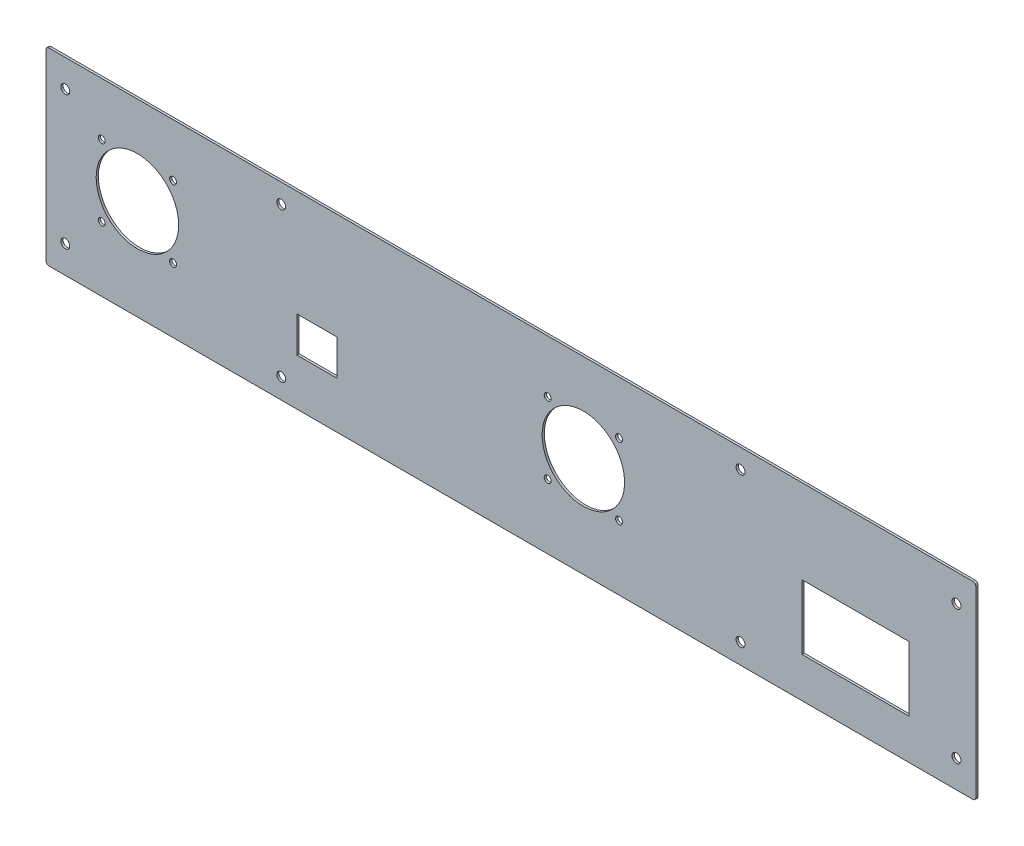
ISO-10303-21;
HEADER;
FILE_DESCRIPTION(('STEP AP214'),'2;1');
FILE_NAME('part.step','',(''),(''),'','','');
FILE_SCHEMA(('AUTOMOTIVE_DESIGN { 1 0 10303 214 1 1 1 1 }'));
ENDSEC;
DATA;
#1=APPLICATION_CONTEXT('core data for automotive mechanical design processes');
#2=APPLICATION_PROTOCOL_DEFINITION('international standard','automotive_design',2000,#1);
#3=PRODUCT_CONTEXT('',#1,'mechanical');
#4=PRODUCT('Part','Part','',(#3));
#5=PRODUCT_RELATED_PRODUCT_CATEGORY('part','',(#4));
#6=PRODUCT_DEFINITION_FORMATION('','',#4);
#7=PRODUCT_DEFINITION_CONTEXT('part definition',#1,'design');
#8=PRODUCT_DEFINITION('design','',#6,#7);
#9=PRODUCT_DEFINITION_SHAPE('','',#8);
#10=(LENGTH_UNIT() NAMED_UNIT(*) SI_UNIT(.MILLI.,.METRE.));
#11=(NAMED_UNIT(*) PLANE_ANGLE_UNIT() SI_UNIT($,.RADIAN.));
#12=(NAMED_UNIT(*) SI_UNIT($,.STERADIAN.) SOLID_ANGLE_UNIT());
#13=UNCERTAINTY_MEASURE_WITH_UNIT(LENGTH_MEASURE(1.E-05),#10,'distance_accuracy_value','');
#14=(GEOMETRIC_REPRESENTATION_CONTEXT(3) GLOBAL_UNCERTAINTY_ASSIGNED_CONTEXT((#13)) GLOBAL_UNIT_ASSIGNED_CONTEXT((#10,
#11,#12)) REPRESENTATION_CONTEXT('',''));
#15=CARTESIAN_POINT('',(0.,0.,0.));
#16=DIRECTION('',(0.,0.,1.));
#17=DIRECTION('',(1.,0.,0.));
#18=AXIS2_PLACEMENT_3D('',#15,#16,#17);
#19=CARTESIAN_POINT('',(0.,0.,1.));
#20=DIRECTION('',(0.,0.,1.));
#21=DIRECTION('',(1.,0.,0.));
#22=AXIS2_PLACEMENT_3D('',#19,#20,#21);
#23=PLANE('',#22);
#24=DIRECTION('',(0.,-1.,0.));
#25=VECTOR('',#24,1.);
#26=CARTESIAN_POINT('',(130.5,37.,1.));
#27=LINE('',#26,#25);
#28=CARTESIAN_POINT('',(130.5,37.,1.));
#29=VERTEX_POINT('',#28);
#30=CARTESIAN_POINT('',(130.5,21.,1.));
#31=VERTEX_POINT('',#30);
#32=EDGE_CURVE('E150',#29,#31,#27,.T.);
#33=ORIENTED_EDGE('',*,*,#32,.T.);
#34=DIRECTION('',(-1.,0.,0.));
#35=VECTOR('',#34,1.);
#36=CARTESIAN_POINT('',(130.5,21.,1.));
#37=LINE('',#36,#35);
#38=CARTESIAN_POINT('',(112.5,21.,1.));
#39=VERTEX_POINT('',#38);
#40=EDGE_CURVE('E159',#31,#39,#37,.T.);
#41=ORIENTED_EDGE('',*,*,#40,.T.);
#42=DIRECTION('',(0.,1.,0.));
#43=VECTOR('',#42,1.);
#44=CARTESIAN_POINT('',(112.5,37.,1.));
#45=LINE('',#44,#43);
#46=CARTESIAN_POINT('',(112.5,37.,1.));
#47=VERTEX_POINT('',#46);
#48=EDGE_CURVE('E50',#39,#47,#45,.T.);
#49=ORIENTED_EDGE('',*,*,#48,.T.);
#50=DIRECTION('',(1.,0.,0.));
#51=VECTOR('',#50,1.);
#52=CARTESIAN_POINT('',(130.5,37.,1.));
#53=LINE('',#52,#51);
#54=EDGE_CURVE('E156',#47,#29,#53,.T.);
#55=ORIENTED_EDGE('',*,*,#54,.T.);
#56=EDGE_LOOP('',(#33,#41,#49,#55));
#57=FACE_BOUND('',#56,.T.);
#58=CARTESIAN_POINT('',(57.,61.,1.));
#59=DIRECTION('',(0.,0.,-1.));
#60=DIRECTION('',(1.,0.,0.));
#61=AXIS2_PLACEMENT_3D('',#58,#59,#60);
#62=CIRCLE('',#61,1.54999999999999);
#63=CARTESIAN_POINT('',(58.55,61.,1.));
#64=VERTEX_POINT('',#63);
#65=EDGE_CURVE('E184',#64,#64,#62,.T.);
#66=ORIENTED_EDGE('',*,*,#65,.T.);
#67=EDGE_LOOP('',(#66));
#68=FACE_BOUND('',#67,.T.);
#69=CARTESIAN_POINT('',(25.,61.,1.));
#70=DIRECTION('',(0.,0.,-1.));
#71=DIRECTION('',(1.,0.,0.));
#72=AXIS2_PLACEMENT_3D('',#69,#70,#71);
#73=CIRCLE('',#72,1.54999999999999);
#74=CARTESIAN_POINT('',(26.55,61.,1.));
#75=VERTEX_POINT('',#74);
#76=EDGE_CURVE('E190',#75,#75,#73,.T.);
#77=ORIENTED_EDGE('',*,*,#76,.T.);
#78=EDGE_LOOP('',(#77));
#79=FACE_BOUND('',#78,.T.);
#80=CARTESIAN_POINT('',(25.,29.,1.));
#81=DIRECTION('',(0.,0.,-1.));
#82=DIRECTION('',(1.,0.,0.));
#83=AXIS2_PLACEMENT_3D('',#80,#81,#82);
#84=CIRCLE('',#83,1.55);
#85=CARTESIAN_POINT('',(26.55,29.,1.));
#86=VERTEX_POINT('',#85);
#87=EDGE_CURVE('E196',#86,#86,#84,.T.);
#88=ORIENTED_EDGE('',*,*,#87,.T.);
#89=EDGE_LOOP('',(#88));
#90=FACE_BOUND('',#89,.T.);
#91=CARTESIAN_POINT('',(57.,29.,1.));
#92=DIRECTION('',(0.,0.,-1.));
#93=DIRECTION('',(1.,0.,0.));
#94=AXIS2_PLACEMENT_3D('',#91,#92,#93);
#95=CIRCLE('',#94,1.54999999999999);
#96=CARTESIAN_POINT('',(58.55,29.,1.));
#97=VERTEX_POINT('',#96);
#98=EDGE_CURVE('E202',#97,#97,#95,.T.);
#99=ORIENTED_EDGE('',*,*,#98,.T.);
#100=EDGE_LOOP('',(#99));
#101=FACE_BOUND('',#100,.T.);
#102=CARTESIAN_POINT('',(225.,29.,1.));
#103=DIRECTION('',(0.,0.,-1.));
#104=DIRECTION('',(-1.,0.,0.));
#105=AXIS2_PLACEMENT_3D('',#102,#103,#104);
#106=CIRCLE('',#105,1.54999999999999);
#107=CARTESIAN_POINT('',(223.45,29.,1.));
#108=VERTEX_POINT('',#107);
#109=EDGE_CURVE('E208',#108,#108,#106,.T.);
#110=ORIENTED_EDGE('',*,*,#109,.T.);
#111=EDGE_LOOP('',(#110));
#112=FACE_BOUND('',#111,.T.);
#113=CARTESIAN_POINT('',(257.,28.9999999999999,1.));
#114=DIRECTION('',(0.,0.,-1.));
#115=DIRECTION('',(-1.,0.,0.));
#116=AXIS2_PLACEMENT_3D('',#113,#114,#115);
#117=CIRCLE('',#116,1.54999999999999);
#118=CARTESIAN_POINT('',(255.45,28.9999999999999,1.));
#119=VERTEX_POINT('',#118);
#120=EDGE_CURVE('E214',#119,#119,#117,.T.);
#121=ORIENTED_EDGE('',*,*,#120,.T.);
#122=EDGE_LOOP('',(#121));
#123=FACE_BOUND('',#122,.T.);
#124=CARTESIAN_POINT('',(225.,61.,1.));
#125=DIRECTION('',(0.,0.,-1.));
#126=DIRECTION('',(-1.,0.,0.));
#127=AXIS2_PLACEMENT_3D('',#124,#125,#126);
#128=CIRCLE('',#127,1.54999999999999);
#129=CARTESIAN_POINT('',(223.45,61.,1.));
#130=VERTEX_POINT('',#129);
#131=EDGE_CURVE('E220',#130,#130,#128,.T.);
#132=ORIENTED_EDGE('',*,*,#131,.T.);
#133=EDGE_LOOP('',(#132));
#134=FACE_BOUND('',#133,.T.);
#135=CARTESIAN_POINT('',(257.,60.9999999999999,1.));
#136=DIRECTION('',(0.,0.,-1.));
#137=DIRECTION('',(-1.,0.,0.));
#138=AXIS2_PLACEMENT_3D('',#135,#136,#137);
#139=CIRCLE('',#138,1.54999999999999);
#140=CARTESIAN_POINT('',(255.45,60.9999999999999,1.));
#141=VERTEX_POINT('',#140);
#142=EDGE_CURVE('E226',#141,#141,#139,.T.);
#143=ORIENTED_EDGE('',*,*,#142,.T.);
#144=EDGE_LOOP('',(#143));
#145=FACE_BOUND('',#144,.T.);
#146=CARTESIAN_POINT('',(241.,44.9999999999999,1.));
#147=DIRECTION('',(0.,0.,-1.));
#148=DIRECTION('',(-1.,0.,0.));
#149=AXIS2_PLACEMENT_3D('',#146,#147,#148);
#150=CIRCLE('',#149,18.5);
#151=CARTESIAN_POINT('',(222.5,44.9999999999999,1.));
#152=VERTEX_POINT('',#151);
#153=EDGE_CURVE('E232',#152,#152,#150,.T.);
#154=ORIENTED_EDGE('',*,*,#153,.T.);
#155=EDGE_LOOP('',(#154));
#156=FACE_BOUND('',#155,.T.);
#157=DIRECTION('',(0.,-1.,0.));
#158=VECTOR('',#157,1.);
#159=CARTESIAN_POINT('',(387.,47.,1.));
#160=LINE('',#159,#158);
#161=CARTESIAN_POINT('',(387.,47.,1.));
#162=VERTEX_POINT('',#161);
#163=CARTESIAN_POINT('',(387.,18.,1.));
#164=VERTEX_POINT('',#163);
#165=EDGE_CURVE('E238',#162,#164,#160,.T.);
#166=ORIENTED_EDGE('',*,*,#165,.T.);
#167=DIRECTION('',(-1.,0.,0.));
#168=VECTOR('',#167,1.);
#169=CARTESIAN_POINT('',(387.,18.,1.));
#170=LINE('',#169,#168);
#171=CARTESIAN_POINT('',(339.,18.,1.));
#172=VERTEX_POINT('',#171);
#173=EDGE_CURVE('E241',#164,#172,#170,.T.);
#174=ORIENTED_EDGE('',*,*,#173,.T.);
#175=DIRECTION('',(0.,1.,0.));
#176=VECTOR('',#175,1.);
#177=CARTESIAN_POINT('',(339.,47.,1.));
#178=LINE('',#177,#176);
#179=CARTESIAN_POINT('',(339.,47.,1.));
#180=VERTEX_POINT('',#179);
#181=EDGE_CURVE('E245',#172,#180,#178,.T.);
#182=ORIENTED_EDGE('',*,*,#181,.T.);
#183=DIRECTION('',(1.,0.,0.));
#184=VECTOR('',#183,1.);
#185=CARTESIAN_POINT('',(387.,47.,1.));
#186=LINE('',#185,#184);
#187=EDGE_CURVE('E248',#180,#162,#186,.T.);
#188=ORIENTED_EDGE('',*,*,#187,.T.);
#189=EDGE_LOOP('',(#166,#174,#182,#188));
#190=FACE_BOUND('',#189,.T.);
#191=CARTESIAN_POINT('',(41.,45.,1.));
#192=DIRECTION('',(0.,0.,-1.));
#193=DIRECTION('',(-1.,0.,0.));
#194=AXIS2_PLACEMENT_3D('',#191,#192,#193);
#195=CIRCLE('',#194,18.5);
#196=CARTESIAN_POINT('',(22.5,45.,1.));
#197=VERTEX_POINT('',#196);
#198=EDGE_CURVE('E270',#197,#197,#195,.T.);
#199=ORIENTED_EDGE('',*,*,#198,.T.);
#200=EDGE_LOOP('',(#199));
#201=FACE_BOUND('',#200,.T.);
#202=CARTESIAN_POINT('',(105.5,9.00000000000172,1.));
#203=DIRECTION('',(0.,0.,1.));
#204=DIRECTION('',(1.,0.,0.));
#205=AXIS2_PLACEMENT_3D('',#202,#203,#204);
#206=CIRCLE('',#205,1.99999999999884);
#207=CARTESIAN_POINT('',(107.499999999999,9.00000000000172,1.));
#208=VERTEX_POINT('',#207);
#209=EDGE_CURVE('E292',#208,#208,#206,.F.);
#210=ORIENTED_EDGE('',*,*,#209,.T.);
#211=EDGE_LOOP('',(#210));
#212=FACE_BOUND('',#211,.T.);
#213=CARTESIAN_POINT('',(408.349999999999,72.35,1.));
#214=DIRECTION('',(0.,0.,1.));
#215=DIRECTION('',(1.,0.,0.));
#216=AXIS2_PLACEMENT_3D('',#213,#214,#215);
#217=CIRCLE('',#216,2.);
#218=CARTESIAN_POINT('',(410.349999999999,72.35,1.));
#219=VERTEX_POINT('',#218);
#220=EDGE_CURVE('E351',#219,#219,#217,.F.);
#221=ORIENTED_EDGE('',*,*,#220,.T.);
#222=EDGE_LOOP('',(#221));
#223=FACE_BOUND('',#222,.T.);
#224=CARTESIAN_POINT('',(8.64999999999981,12.35,1.));
#225=DIRECTION('',(0.,0.,1.));
#226=DIRECTION('',(1.,0.,0.));
#227=AXIS2_PLACEMENT_3D('',#224,#225,#226);
#228=CIRCLE('',#227,2.);
#229=CARTESIAN_POINT('',(10.6499999999998,12.35,1.));
#230=VERTEX_POINT('',#229);
#231=EDGE_CURVE('E354',#230,#230,#228,.F.);
#232=ORIENTED_EDGE('',*,*,#231,.T.);
#233=EDGE_LOOP('',(#232));
#234=FACE_BOUND('',#233,.T.);
#235=CARTESIAN_POINT('',(311.5,76.0000000000001,1.));
#236=DIRECTION('',(0.,0.,1.));
#237=DIRECTION('',(1.,0.,0.));
#238=AXIS2_PLACEMENT_3D('',#235,#236,#237);
#239=CIRCLE('',#238,2.);
#240=CARTESIAN_POINT('',(313.5,76.0000000000001,1.));
#241=VERTEX_POINT('',#240);
#242=EDGE_CURVE('E357',#241,#241,#239,.F.);
#243=ORIENTED_EDGE('',*,*,#242,.T.);
#244=EDGE_LOOP('',(#243));
#245=FACE_BOUND('',#244,.T.);
#246=CARTESIAN_POINT('',(105.5,76.0000000000001,1.));
#247=DIRECTION('',(0.,0.,1.));
#248=DIRECTION('',(1.,0.,0.));
#249=AXIS2_PLACEMENT_3D('',#246,#247,#248);
#250=CIRCLE('',#249,2.);
#251=CARTESIAN_POINT('',(107.5,76.0000000000001,1.));
#252=VERTEX_POINT('',#251);
#253=EDGE_CURVE('E360',#252,#252,#250,.F.);
#254=ORIENTED_EDGE('',*,*,#253,.T.);
#255=EDGE_LOOP('',(#254));
#256=FACE_BOUND('',#255,.T.);
#257=CARTESIAN_POINT('',(8.64999999999981,72.35,1.));
#258=DIRECTION('',(0.,0.,1.));
#259=DIRECTION('',(1.,0.,0.));
#260=AXIS2_PLACEMENT_3D('',#257,#258,#259);
#261=CIRCLE('',#260,2.);
#262=CARTESIAN_POINT('',(10.6499999999998,72.35,1.));
#263=VERTEX_POINT('',#262);
#264=EDGE_CURVE('E363',#263,#263,#261,.F.);
#265=ORIENTED_EDGE('',*,*,#264,.T.);
#266=EDGE_LOOP('',(#265));
#267=FACE_BOUND('',#266,.T.);
#268=CARTESIAN_POINT('',(311.5,8.99999999999905,1.));
#269=DIRECTION('',(0.,0.,1.));
#270=DIRECTION('',(1.,0.,0.));
#271=AXIS2_PLACEMENT_3D('',#268,#269,#270);
#272=CIRCLE('',#271,2.);
#273=CARTESIAN_POINT('',(313.5,8.99999999999905,1.));
#274=VERTEX_POINT('',#273);
#275=EDGE_CURVE('E366',#274,#274,#272,.F.);
#276=ORIENTED_EDGE('',*,*,#275,.T.);
#277=EDGE_LOOP('',(#276));
#278=FACE_BOUND('',#277,.T.);
#279=CARTESIAN_POINT('',(408.349999999999,12.35,1.));
#280=DIRECTION('',(0.,0.,1.));
#281=DIRECTION('',(1.,0.,0.));
#282=AXIS2_PLACEMENT_3D('',#279,#280,#281);
#283=CIRCLE('',#282,2.);
#284=CARTESIAN_POINT('',(410.349999999999,12.35,1.));
#285=VERTEX_POINT('',#284);
#286=EDGE_CURVE('E295',#285,#285,#283,.F.);
#287=ORIENTED_EDGE('',*,*,#286,.T.);
#288=EDGE_LOOP('',(#287));
#289=FACE_BOUND('',#288,.T.);
#290=DIRECTION('',(1.,0.,0.));
#291=VECTOR('',#290,1.);
#292=CARTESIAN_POINT('',(1.3,0.,1.));
#293=LINE('',#292,#291);
#294=CARTESIAN_POINT('',(415.7,0.,1.));
#295=VERTEX_POINT('',#294);
#296=CARTESIAN_POINT('',(1.3,0.,1.));
#297=VERTEX_POINT('',#296);
#298=EDGE_CURVE('E302',#295,#297,#293,.F.);
#299=ORIENTED_EDGE('',*,*,#298,.F.);
#300=CARTESIAN_POINT('',(415.7,1.3,1.));
#301=DIRECTION('',(0.,0.,1.));
#302=DIRECTION('',(1.,0.,0.));
#303=AXIS2_PLACEMENT_3D('',#300,#301,#302);
#304=CIRCLE('',#303,1.30000000000002);
#305=CARTESIAN_POINT('',(417.,1.3,1.));
#306=VERTEX_POINT('',#305);
#307=EDGE_CURVE('E296',#306,#295,#304,.F.);
#308=ORIENTED_EDGE('',*,*,#307,.F.);
#309=DIRECTION('',(0.,1.,0.));
#310=VECTOR('',#309,1.);
#311=CARTESIAN_POINT('',(417.,1.3,1.));
#312=LINE('',#311,#310);
#313=CARTESIAN_POINT('',(417.,83.4,1.));
#314=VERTEX_POINT('',#313);
#315=EDGE_CURVE('E273',#314,#306,#312,.F.);
#316=ORIENTED_EDGE('',*,*,#315,.F.);
#317=CARTESIAN_POINT('',(415.7,83.4,1.));
#318=DIRECTION('',(0.,0.,1.));
#319=DIRECTION('',(1.,0.,0.));
#320=AXIS2_PLACEMENT_3D('',#317,#318,#319);
#321=CIRCLE('',#320,1.30000000000002);
#322=CARTESIAN_POINT('',(415.7,84.7,1.));
#323=VERTEX_POINT('',#322);
#324=EDGE_CURVE('E37',#323,#314,#321,.F.);
#325=ORIENTED_EDGE('',*,*,#324,.F.);
#326=DIRECTION('',(1.,0.,0.));
#327=VECTOR('',#326,1.);
#328=CARTESIAN_POINT('',(415.7,84.7,1.));
#329=LINE('',#328,#327);
#330=CARTESIAN_POINT('',(1.30000000000001,84.7,1.));
#331=VERTEX_POINT('',#330);
#332=EDGE_CURVE('E314',#331,#323,#329,.T.);
#333=ORIENTED_EDGE('',*,*,#332,.F.);
#334=CARTESIAN_POINT('',(1.3,83.4,1.));
#335=DIRECTION('',(0.,0.,1.));
#336=DIRECTION('',(1.,0.,0.));
#337=AXIS2_PLACEMENT_3D('',#334,#335,#336);
#338=CIRCLE('',#337,1.3);
#339=CARTESIAN_POINT('',(0.,83.4,1.));
#340=VERTEX_POINT('',#339);
#341=EDGE_CURVE('E311',#340,#331,#338,.F.);
#342=ORIENTED_EDGE('',*,*,#341,.F.);
#343=DIRECTION('',(0.,1.,0.));
#344=VECTOR('',#343,1.);
#345=CARTESIAN_POINT('',(0.,83.4,1.));
#346=LINE('',#345,#344);
#347=CARTESIAN_POINT('',(0.,1.3,1.));
#348=VERTEX_POINT('',#347);
#349=EDGE_CURVE('E308',#348,#340,#346,.T.);
#350=ORIENTED_EDGE('',*,*,#349,.F.);
#351=CARTESIAN_POINT('',(1.3,1.3,1.));
#352=DIRECTION('',(0.,0.,1.));
#353=DIRECTION('',(1.,0.,0.));
#354=AXIS2_PLACEMENT_3D('',#351,#352,#353);
#355=CIRCLE('',#354,1.3);
#356=EDGE_CURVE('E305',#297,#348,#355,.F.);
#357=ORIENTED_EDGE('',*,*,#356,.F.);
#358=EDGE_LOOP('',(#299,#308,#316,#325,#333,#342,#350,#357));
#359=FACE_BOUND('',#358,.T.);
#360=ADVANCED_FACE('F34',(#57,#68,#79,#90,#101,#112,#123,#134,#145,#156,#190,#201,#212,#223,
#234,#245,#256,#267,#278,#289,#359),#23,.T.);
#361=CARTESIAN_POINT('',(417.,1.3,0.));
#362=DIRECTION('',(1.,0.,0.));
#363=DIRECTION('',(0.,0.,-1.));
#364=AXIS2_PLACEMENT_3D('',#361,#362,#363);
#365=PLANE('',#364);
#366=ORIENTED_EDGE('',*,*,#315,.T.);
#367=DIRECTION('',(0.,0.,1.));
#368=VECTOR('',#367,1.);
#369=CARTESIAN_POINT('',(417.,1.3,0.));
#370=LINE('',#369,#368);
#371=CARTESIAN_POINT('',(417.,1.3,0.));
#372=VERTEX_POINT('',#371);
#373=EDGE_CURVE('E297',#372,#306,#370,.T.);
#374=ORIENTED_EDGE('',*,*,#373,.F.);
#375=DIRECTION('',(0.,1.,0.));
#376=VECTOR('',#375,1.);
#377=CARTESIAN_POINT('',(417.,0.,0.));
#378=LINE('',#377,#376);
#379=CARTESIAN_POINT('',(417.,83.4,0.));
#380=VERTEX_POINT('',#379);
#381=EDGE_CURVE('E289',#372,#380,#378,.T.);
#382=ORIENTED_EDGE('',*,*,#381,.T.);
#383=DIRECTION('',(0.,0.,1.));
#384=VECTOR('',#383,1.);
#385=CARTESIAN_POINT('',(417.,83.4,0.));
#386=LINE('',#385,#384);
#387=EDGE_CURVE('E315',#314,#380,#386,.F.);
#388=ORIENTED_EDGE('',*,*,#387,.F.);
#389=EDGE_LOOP('',(#366,#374,#382,#388));
#390=FACE_BOUND('',#389,.T.);
#391=ADVANCED_FACE('F397',(#390),#365,.T.);
#392=CARTESIAN_POINT('',(415.7,83.4,0.));
#393=DIRECTION('',(0.,0.,1.));
#394=DIRECTION('',(1.,0.,0.));
#395=AXIS2_PLACEMENT_3D('',#392,#393,#394);
#396=CYLINDRICAL_SURFACE('',#395,1.30000000000002);
#397=ORIENTED_EDGE('',*,*,#324,.T.);
#398=ORIENTED_EDGE('',*,*,#387,.T.);
#399=CARTESIAN_POINT('',(415.7,83.4,0.));
#400=DIRECTION('',(0.,0.,1.));
#401=DIRECTION('',(1.,0.,0.));
#402=AXIS2_PLACEMENT_3D('',#399,#400,#401);
#403=CIRCLE('',#402,1.30000000000002);
#404=CARTESIAN_POINT('',(415.7,84.7,0.));
#405=VERTEX_POINT('',#404);
#406=EDGE_CURVE('E288',#380,#405,#403,.T.);
#407=ORIENTED_EDGE('',*,*,#406,.T.);
#408=DIRECTION('',(0.,0.,1.));
#409=VECTOR('',#408,1.);
#410=CARTESIAN_POINT('',(415.7,84.7,0.));
#411=LINE('',#410,#409);
#412=EDGE_CURVE('E312',#323,#405,#411,.F.);
#413=ORIENTED_EDGE('',*,*,#412,.F.);
#414=EDGE_LOOP('',(#397,#398,#407,#413));
#415=FACE_BOUND('',#414,.T.);
#416=ADVANCED_FACE('F394',(#415),#396,.T.);
#417=CARTESIAN_POINT('',(415.7,84.7,0.));
#418=DIRECTION('',(0.,1.,0.));
#419=DIRECTION('',(0.,0.,1.));
#420=AXIS2_PLACEMENT_3D('',#417,#418,#419);
#421=PLANE('',#420);
#422=ORIENTED_EDGE('',*,*,#332,.T.);
#423=ORIENTED_EDGE('',*,*,#412,.T.);
#424=DIRECTION('',(1.,0.,0.));
#425=VECTOR('',#424,1.);
#426=CARTESIAN_POINT('',(0.,84.7,0.));
#427=LINE('',#426,#425);
#428=CARTESIAN_POINT('',(1.3,84.7,0.));
#429=VERTEX_POINT('',#428);
#430=EDGE_CURVE('E285',#405,#429,#427,.F.);
#431=ORIENTED_EDGE('',*,*,#430,.T.);
#432=DIRECTION('',(0.,0.,1.));
#433=VECTOR('',#432,1.);
#434=CARTESIAN_POINT('',(1.3,84.7,0.));
#435=LINE('',#434,#433);
#436=EDGE_CURVE('E309',#331,#429,#435,.F.);
#437=ORIENTED_EDGE('',*,*,#436,.F.);
#438=EDGE_LOOP('',(#422,#423,#431,#437));
#439=FACE_BOUND('',#438,.T.);
#440=ADVANCED_FACE('F386',(#439),#421,.T.);
#441=CARTESIAN_POINT('',(1.3,83.4,0.));
#442=DIRECTION('',(0.,0.,1.));
#443=DIRECTION('',(1.,0.,0.));
#444=AXIS2_PLACEMENT_3D('',#441,#442,#443);
#445=CYLINDRICAL_SURFACE('',#444,1.3);
#446=ORIENTED_EDGE('',*,*,#341,.T.);
#447=ORIENTED_EDGE('',*,*,#436,.T.);
#448=CARTESIAN_POINT('',(1.3,83.4,0.));
#449=DIRECTION('',(0.,0.,1.));
#450=DIRECTION('',(1.,0.,0.));
#451=AXIS2_PLACEMENT_3D('',#448,#449,#450);
#452=CIRCLE('',#451,1.3);
#453=CARTESIAN_POINT('',(0.,83.4,0.));
#454=VERTEX_POINT('',#453);
#455=EDGE_CURVE('E284',#429,#454,#452,.T.);
#456=ORIENTED_EDGE('',*,*,#455,.T.);
#457=DIRECTION('',(0.,0.,1.));
#458=VECTOR('',#457,1.);
#459=CARTESIAN_POINT('',(0.,83.4,0.));
#460=LINE('',#459,#458);
#461=EDGE_CURVE('E306',#340,#454,#460,.F.);
#462=ORIENTED_EDGE('',*,*,#461,.F.);
#463=EDGE_LOOP('',(#446,#447,#456,#462));
#464=FACE_BOUND('',#463,.T.);
#465=ADVANCED_FACE('F376',(#464),#445,.T.);
#466=CARTESIAN_POINT('',(0.,83.4,0.));
#467=DIRECTION('',(-1.,0.,0.));
#468=DIRECTION('',(0.,0.,1.));
#469=AXIS2_PLACEMENT_3D('',#466,#467,#468);
#470=PLANE('',#469);
#471=ORIENTED_EDGE('',*,*,#349,.T.);
#472=ORIENTED_EDGE('',*,*,#461,.T.);
#473=DIRECTION('',(0.,1.,0.));
#474=VECTOR('',#473,1.);
#475=CARTESIAN_POINT('',(0.,0.,0.));
#476=LINE('',#475,#474);
#477=CARTESIAN_POINT('',(0.,1.3,0.));
#478=VERTEX_POINT('',#477);
#479=EDGE_CURVE('E281',#454,#478,#476,.F.);
#480=ORIENTED_EDGE('',*,*,#479,.T.);
#481=DIRECTION('',(0.,0.,1.));
#482=VECTOR('',#481,1.);
#483=CARTESIAN_POINT('',(0.,1.3,0.));
#484=LINE('',#483,#482);
#485=EDGE_CURVE('E303',#348,#478,#484,.F.);
#486=ORIENTED_EDGE('',*,*,#485,.F.);
#487=EDGE_LOOP('',(#471,#472,#480,#486));
#488=FACE_BOUND('',#487,.T.);
#489=ADVANCED_FACE('F411',(#488),#470,.T.);
#490=CARTESIAN_POINT('',(1.3,1.3,0.));
#491=DIRECTION('',(0.,0.,1.));
#492=DIRECTION('',(1.,0.,0.));
#493=AXIS2_PLACEMENT_3D('',#490,#491,#492);
#494=CYLINDRICAL_SURFACE('',#493,1.3);
#495=ORIENTED_EDGE('',*,*,#356,.T.);
#496=ORIENTED_EDGE('',*,*,#485,.T.);
#497=CARTESIAN_POINT('',(1.3,1.3,0.));
#498=DIRECTION('',(0.,0.,1.));
#499=DIRECTION('',(1.,0.,0.));
#500=AXIS2_PLACEMENT_3D('',#497,#498,#499);
#501=CIRCLE('',#500,1.3);
#502=CARTESIAN_POINT('',(1.3,0.,0.));
#503=VERTEX_POINT('',#502);
#504=EDGE_CURVE('E280',#478,#503,#501,.T.);
#505=ORIENTED_EDGE('',*,*,#504,.T.);
#506=DIRECTION('',(0.,0.,-1.));
#507=VECTOR('',#506,1.);
#508=CARTESIAN_POINT('',(1.3,0.,0.));
#509=LINE('',#508,#507);
#510=EDGE_CURVE('E300',#297,#503,#509,.T.);
#511=ORIENTED_EDGE('',*,*,#510,.F.);
#512=EDGE_LOOP('',(#495,#496,#505,#511));
#513=FACE_BOUND('',#512,.T.);
#514=ADVANCED_FACE('F408',(#513),#494,.T.);
#515=CARTESIAN_POINT('',(1.3,0.,0.));
#516=DIRECTION('',(0.,-1.,0.));
#517=DIRECTION('',(0.,0.,-1.));
#518=AXIS2_PLACEMENT_3D('',#515,#516,#517);
#519=PLANE('',#518);
#520=ORIENTED_EDGE('',*,*,#298,.T.);
#521=ORIENTED_EDGE('',*,*,#510,.T.);
#522=DIRECTION('',(1.,0.,0.));
#523=VECTOR('',#522,1.);
#524=CARTESIAN_POINT('',(0.,0.,0.));
#525=LINE('',#524,#523);
#526=CARTESIAN_POINT('',(415.7,0.,0.));
#527=VERTEX_POINT('',#526);
#528=EDGE_CURVE('E276',#503,#527,#525,.T.);
#529=ORIENTED_EDGE('',*,*,#528,.T.);
#530=DIRECTION('',(0.,0.,1.));
#531=VECTOR('',#530,1.);
#532=CARTESIAN_POINT('',(415.7,0.,0.));
#533=LINE('',#532,#531);
#534=EDGE_CURVE('E293',#295,#527,#533,.F.);
#535=ORIENTED_EDGE('',*,*,#534,.F.);
#536=EDGE_LOOP('',(#520,#521,#529,#535));
#537=FACE_BOUND('',#536,.T.);
#538=ADVANCED_FACE('F404',(#537),#519,.T.);
#539=CARTESIAN_POINT('',(415.7,1.3,0.));
#540=DIRECTION('',(0.,0.,1.));
#541=DIRECTION('',(1.,0.,0.));
#542=AXIS2_PLACEMENT_3D('',#539,#540,#541);
#543=CYLINDRICAL_SURFACE('',#542,1.30000000000002);
#544=ORIENTED_EDGE('',*,*,#307,.T.);
#545=ORIENTED_EDGE('',*,*,#534,.T.);
#546=CARTESIAN_POINT('',(415.7,1.3,0.));
#547=DIRECTION('',(0.,0.,1.));
#548=DIRECTION('',(1.,0.,0.));
#549=AXIS2_PLACEMENT_3D('',#546,#547,#548);
#550=CIRCLE('',#549,1.30000000000002);
#551=EDGE_CURVE('E279',#527,#372,#550,.T.);
#552=ORIENTED_EDGE('',*,*,#551,.T.);
#553=ORIENTED_EDGE('',*,*,#373,.T.);
#554=EDGE_LOOP('',(#544,#545,#552,#553));
#555=FACE_BOUND('',#554,.T.);
#556=ADVANCED_FACE('F413',(#555),#543,.T.);
#557=CARTESIAN_POINT('',(408.349999999999,12.35,0.));
#558=DIRECTION('',(0.,0.,1.));
#559=DIRECTION('',(1.,0.,0.));
#560=AXIS2_PLACEMENT_3D('',#557,#558,#559);
#561=CYLINDRICAL_SURFACE('',#560,2.);
#562=CARTESIAN_POINT('',(408.349999999999,12.35,0.));
#563=DIRECTION('',(0.,0.,1.));
#564=DIRECTION('',(1.,0.,0.));
#565=AXIS2_PLACEMENT_3D('',#562,#563,#564);
#566=CIRCLE('',#565,2.);
#567=CARTESIAN_POINT('',(410.349999999999,12.35,0.));
#568=VERTEX_POINT('',#567);
#569=EDGE_CURVE('E338',#568,#568,#566,.F.);
#570=ORIENTED_EDGE('',*,*,#569,.T.);
#571=EDGE_LOOP('',(#570));
#572=FACE_BOUND('',#571,.T.);
#573=ORIENTED_EDGE('',*,*,#286,.F.);
#574=EDGE_LOOP('',(#573));
#575=FACE_BOUND('',#574,.T.);
#576=ADVANCED_FACE('F415',(#572,#575),#561,.F.);
#577=CARTESIAN_POINT('',(311.5,8.99999999999905,0.));
#578=DIRECTION('',(0.,0.,1.));
#579=DIRECTION('',(1.,0.,0.));
#580=AXIS2_PLACEMENT_3D('',#577,#578,#579);
#581=CYLINDRICAL_SURFACE('',#580,2.);
#582=CARTESIAN_POINT('',(311.5,8.99999999999905,0.));
#583=DIRECTION('',(0.,0.,1.));
#584=DIRECTION('',(1.,0.,0.));
#585=AXIS2_PLACEMENT_3D('',#582,#583,#584);
#586=CIRCLE('',#585,2.);
#587=CARTESIAN_POINT('',(313.5,8.99999999999905,0.));
#588=VERTEX_POINT('',#587);
#589=EDGE_CURVE('E335',#588,#588,#586,.F.);
#590=ORIENTED_EDGE('',*,*,#589,.T.);
#591=EDGE_LOOP('',(#590));
#592=FACE_BOUND('',#591,.T.);
#593=ORIENTED_EDGE('',*,*,#275,.F.);
#594=EDGE_LOOP('',(#593));
#595=FACE_BOUND('',#594,.T.);
#596=ADVANCED_FACE('F421',(#592,#595),#581,.F.);
#597=CARTESIAN_POINT('',(8.64999999999981,72.35,0.));
#598=DIRECTION('',(0.,0.,1.));
#599=DIRECTION('',(1.,0.,0.));
#600=AXIS2_PLACEMENT_3D('',#597,#598,#599);
#601=CYLINDRICAL_SURFACE('',#600,2.);
#602=CARTESIAN_POINT('',(8.64999999999981,72.35,0.));
#603=DIRECTION('',(0.,0.,1.));
#604=DIRECTION('',(1.,0.,0.));
#605=AXIS2_PLACEMENT_3D('',#602,#603,#604);
#606=CIRCLE('',#605,2.);
#607=CARTESIAN_POINT('',(10.6499999999998,72.35,0.));
#608=VERTEX_POINT('',#607);
#609=EDGE_CURVE('E332',#608,#608,#606,.F.);
#610=ORIENTED_EDGE('',*,*,#609,.T.);
#611=EDGE_LOOP('',(#610));
#612=FACE_BOUND('',#611,.T.);
#613=ORIENTED_EDGE('',*,*,#264,.F.);
#614=EDGE_LOOP('',(#613));
#615=FACE_BOUND('',#614,.T.);
#616=ADVANCED_FACE('F457',(#612,#615),#601,.F.);
#617=CARTESIAN_POINT('',(105.5,76.0000000000001,0.));
#618=DIRECTION('',(0.,0.,1.));
#619=DIRECTION('',(1.,0.,0.));
#620=AXIS2_PLACEMENT_3D('',#617,#618,#619);
#621=CYLINDRICAL_SURFACE('',#620,2.);
#622=CARTESIAN_POINT('',(105.5,76.0000000000001,0.));
#623=DIRECTION('',(0.,0.,1.));
#624=DIRECTION('',(1.,0.,0.));
#625=AXIS2_PLACEMENT_3D('',#622,#623,#624);
#626=CIRCLE('',#625,2.);
#627=CARTESIAN_POINT('',(107.5,76.0000000000001,0.));
#628=VERTEX_POINT('',#627);
#629=EDGE_CURVE('E329',#628,#628,#626,.F.);
#630=ORIENTED_EDGE('',*,*,#629,.T.);
#631=EDGE_LOOP('',(#630));
#632=FACE_BOUND('',#631,.T.);
#633=ORIENTED_EDGE('',*,*,#253,.F.);
#634=EDGE_LOOP('',(#633));
#635=FACE_BOUND('',#634,.T.);
#636=ADVANCED_FACE('F453',(#632,#635),#621,.F.);
#637=CARTESIAN_POINT('',(311.5,76.0000000000001,0.));
#638=DIRECTION('',(0.,0.,1.));
#639=DIRECTION('',(1.,0.,0.));
#640=AXIS2_PLACEMENT_3D('',#637,#638,#639);
#641=CYLINDRICAL_SURFACE('',#640,2.);
#642=CARTESIAN_POINT('',(311.5,76.0000000000001,0.));
#643=DIRECTION('',(0.,0.,1.));
#644=DIRECTION('',(1.,0.,0.));
#645=AXIS2_PLACEMENT_3D('',#642,#643,#644);
#646=CIRCLE('',#645,2.);
#647=CARTESIAN_POINT('',(313.5,76.0000000000001,0.));
#648=VERTEX_POINT('',#647);
#649=EDGE_CURVE('E326',#648,#648,#646,.F.);
#650=ORIENTED_EDGE('',*,*,#649,.T.);
#651=EDGE_LOOP('',(#650));
#652=FACE_BOUND('',#651,.T.);
#653=ORIENTED_EDGE('',*,*,#242,.F.);
#654=EDGE_LOOP('',(#653));
#655=FACE_BOUND('',#654,.T.);
#656=ADVANCED_FACE('F449',(#652,#655),#641,.F.);
#657=CARTESIAN_POINT('',(8.64999999999981,12.35,0.));
#658=DIRECTION('',(0.,0.,1.));
#659=DIRECTION('',(1.,0.,0.));
#660=AXIS2_PLACEMENT_3D('',#657,#658,#659);
#661=CYLINDRICAL_SURFACE('',#660,2.);
#662=CARTESIAN_POINT('',(8.64999999999981,12.35,0.));
#663=DIRECTION('',(0.,0.,1.));
#664=DIRECTION('',(1.,0.,0.));
#665=AXIS2_PLACEMENT_3D('',#662,#663,#664);
#666=CIRCLE('',#665,2.);
#667=CARTESIAN_POINT('',(10.6499999999998,12.35,0.));
#668=VERTEX_POINT('',#667);
#669=EDGE_CURVE('E323',#668,#668,#666,.F.);
#670=ORIENTED_EDGE('',*,*,#669,.T.);
#671=EDGE_LOOP('',(#670));
#672=FACE_BOUND('',#671,.T.);
#673=ORIENTED_EDGE('',*,*,#231,.F.);
#674=EDGE_LOOP('',(#673));
#675=FACE_BOUND('',#674,.T.);
#676=ADVANCED_FACE('F445',(#672,#675),#661,.F.);
#677=CARTESIAN_POINT('',(408.349999999999,72.35,0.));
#678=DIRECTION('',(0.,0.,1.));
#679=DIRECTION('',(1.,0.,0.));
#680=AXIS2_PLACEMENT_3D('',#677,#678,#679);
#681=CYLINDRICAL_SURFACE('',#680,2.);
#682=CARTESIAN_POINT('',(408.349999999999,72.35,0.));
#683=DIRECTION('',(0.,0.,1.));
#684=DIRECTION('',(1.,0.,0.));
#685=AXIS2_PLACEMENT_3D('',#682,#683,#684);
#686=CIRCLE('',#685,2.);
#687=CARTESIAN_POINT('',(410.349999999999,72.35,0.));
#688=VERTEX_POINT('',#687);
#689=EDGE_CURVE('E42',#688,#688,#686,.F.);
#690=ORIENTED_EDGE('',*,*,#689,.T.);
#691=EDGE_LOOP('',(#690));
#692=FACE_BOUND('',#691,.T.);
#693=ORIENTED_EDGE('',*,*,#220,.F.);
#694=EDGE_LOOP('',(#693));
#695=FACE_BOUND('',#694,.T.);
#696=ADVANCED_FACE('F437',(#692,#695),#681,.F.);
#697=CARTESIAN_POINT('',(105.5,9.00000000000172,0.));
#698=DIRECTION('',(0.,0.,1.));
#699=DIRECTION('',(1.,0.,0.));
#700=AXIS2_PLACEMENT_3D('',#697,#698,#699);
#701=CYLINDRICAL_SURFACE('',#700,1.99999999999884);
#702=CARTESIAN_POINT('',(105.5,9.00000000000172,0.));
#703=DIRECTION('',(0.,0.,1.));
#704=DIRECTION('',(1.,0.,0.));
#705=AXIS2_PLACEMENT_3D('',#702,#703,#704);
#706=CIRCLE('',#705,1.99999999999884);
#707=CARTESIAN_POINT('',(107.499999999999,9.00000000000172,0.));
#708=VERTEX_POINT('',#707);
#709=EDGE_CURVE('E11',#708,#708,#706,.F.);
#710=ORIENTED_EDGE('',*,*,#709,.T.);
#711=EDGE_LOOP('',(#710));
#712=FACE_BOUND('',#711,.T.);
#713=ORIENTED_EDGE('',*,*,#209,.F.);
#714=EDGE_LOOP('',(#713));
#715=FACE_BOUND('',#714,.T.);
#716=ADVANCED_FACE('F427',(#712,#715),#701,.F.);
#717=CARTESIAN_POINT('',(0.,0.,0.));
#718=DIRECTION('',(0.,0.,1.));
#719=DIRECTION('',(1.,0.,0.));
#720=AXIS2_PLACEMENT_3D('',#717,#718,#719);
#721=PLANE('',#720);
#722=DIRECTION('',(-1.,0.,0.));
#723=VECTOR('',#722,1.);
#724=CARTESIAN_POINT('',(130.5,21.,0.));
#725=LINE('',#724,#723);
#726=CARTESIAN_POINT('',(130.5,21.,0.));
#727=VERTEX_POINT('',#726);
#728=CARTESIAN_POINT('',(112.5,21.,0.));
#729=VERTEX_POINT('',#728);
#730=EDGE_CURVE('E174',#727,#729,#725,.T.);
#731=ORIENTED_EDGE('',*,*,#730,.F.);
#732=DIRECTION('',(0.,-1.,0.));
#733=VECTOR('',#732,1.);
#734=CARTESIAN_POINT('',(130.5,37.,0.));
#735=LINE('',#734,#733);
#736=CARTESIAN_POINT('',(130.5,37.,0.));
#737=VERTEX_POINT('',#736);
#738=EDGE_CURVE('E58',#737,#727,#735,.T.);
#739=ORIENTED_EDGE('',*,*,#738,.F.);
#740=DIRECTION('',(1.,0.,0.));
#741=VECTOR('',#740,1.);
#742=CARTESIAN_POINT('',(130.5,37.,0.));
#743=LINE('',#742,#741);
#744=CARTESIAN_POINT('',(112.5,37.,0.));
#745=VERTEX_POINT('',#744);
#746=EDGE_CURVE('E165',#745,#737,#743,.T.);
#747=ORIENTED_EDGE('',*,*,#746,.F.);
#748=DIRECTION('',(0.,1.,0.));
#749=VECTOR('',#748,1.);
#750=CARTESIAN_POINT('',(112.5,37.,0.));
#751=LINE('',#750,#749);
#752=EDGE_CURVE('E168',#729,#745,#751,.T.);
#753=ORIENTED_EDGE('',*,*,#752,.F.);
#754=EDGE_LOOP('',(#731,#739,#747,#753));
#755=FACE_BOUND('',#754,.T.);
#756=CARTESIAN_POINT('',(57.,61.,0.));
#757=DIRECTION('',(0.,0.,-1.));
#758=DIRECTION('',(1.,0.,0.));
#759=AXIS2_PLACEMENT_3D('',#756,#757,#758);
#760=CIRCLE('',#759,1.54999999999999);
#761=CARTESIAN_POINT('',(58.55,61.,0.));
#762=VERTEX_POINT('',#761);
#763=EDGE_CURVE('E180',#762,#762,#760,.T.);
#764=ORIENTED_EDGE('',*,*,#763,.F.);
#765=EDGE_LOOP('',(#764));
#766=FACE_BOUND('',#765,.T.);
#767=CARTESIAN_POINT('',(25.,61.,0.));
#768=DIRECTION('',(0.,0.,-1.));
#769=DIRECTION('',(1.,0.,0.));
#770=AXIS2_PLACEMENT_3D('',#767,#768,#769);
#771=CIRCLE('',#770,1.54999999999999);
#772=CARTESIAN_POINT('',(26.55,61.,0.));
#773=VERTEX_POINT('',#772);
#774=EDGE_CURVE('E187',#773,#773,#771,.T.);
#775=ORIENTED_EDGE('',*,*,#774,.F.);
#776=EDGE_LOOP('',(#775));
#777=FACE_BOUND('',#776,.T.);
#778=CARTESIAN_POINT('',(25.,29.,0.));
#779=DIRECTION('',(0.,0.,-1.));
#780=DIRECTION('',(1.,0.,0.));
#781=AXIS2_PLACEMENT_3D('',#778,#779,#780);
#782=CIRCLE('',#781,1.55);
#783=CARTESIAN_POINT('',(26.55,29.,0.));
#784=VERTEX_POINT('',#783);
#785=EDGE_CURVE('E193',#784,#784,#782,.T.);
#786=ORIENTED_EDGE('',*,*,#785,.F.);
#787=EDGE_LOOP('',(#786));
#788=FACE_BOUND('',#787,.T.);
#789=CARTESIAN_POINT('',(57.,29.,0.));
#790=DIRECTION('',(0.,0.,-1.));
#791=DIRECTION('',(1.,0.,0.));
#792=AXIS2_PLACEMENT_3D('',#789,#790,#791);
#793=CIRCLE('',#792,1.54999999999999);
#794=CARTESIAN_POINT('',(58.55,29.,0.));
#795=VERTEX_POINT('',#794);
#796=EDGE_CURVE('E199',#795,#795,#793,.T.);
#797=ORIENTED_EDGE('',*,*,#796,.F.);
#798=EDGE_LOOP('',(#797));
#799=FACE_BOUND('',#798,.T.);
#800=CARTESIAN_POINT('',(225.,29.,0.));
#801=DIRECTION('',(0.,0.,-1.));
#802=DIRECTION('',(-1.,0.,0.));
#803=AXIS2_PLACEMENT_3D('',#800,#801,#802);
#804=CIRCLE('',#803,1.54999999999999);
#805=CARTESIAN_POINT('',(223.45,29.,0.));
#806=VERTEX_POINT('',#805);
#807=EDGE_CURVE('E205',#806,#806,#804,.T.);
#808=ORIENTED_EDGE('',*,*,#807,.F.);
#809=EDGE_LOOP('',(#808));
#810=FACE_BOUND('',#809,.T.);
#811=CARTESIAN_POINT('',(257.,28.9999999999999,0.));
#812=DIRECTION('',(0.,0.,-1.));
#813=DIRECTION('',(-1.,0.,0.));
#814=AXIS2_PLACEMENT_3D('',#811,#812,#813);
#815=CIRCLE('',#814,1.54999999999999);
#816=CARTESIAN_POINT('',(255.45,28.9999999999999,0.));
#817=VERTEX_POINT('',#816);
#818=EDGE_CURVE('E211',#817,#817,#815,.T.);
#819=ORIENTED_EDGE('',*,*,#818,.F.);
#820=EDGE_LOOP('',(#819));
#821=FACE_BOUND('',#820,.T.);
#822=CARTESIAN_POINT('',(225.,61.,0.));
#823=DIRECTION('',(0.,0.,-1.));
#824=DIRECTION('',(-1.,0.,0.));
#825=AXIS2_PLACEMENT_3D('',#822,#823,#824);
#826=CIRCLE('',#825,1.54999999999999);
#827=CARTESIAN_POINT('',(223.45,61.,0.));
#828=VERTEX_POINT('',#827);
#829=EDGE_CURVE('E217',#828,#828,#826,.T.);
#830=ORIENTED_EDGE('',*,*,#829,.F.);
#831=EDGE_LOOP('',(#830));
#832=FACE_BOUND('',#831,.T.);
#833=CARTESIAN_POINT('',(257.,60.9999999999999,0.));
#834=DIRECTION('',(0.,0.,-1.));
#835=DIRECTION('',(-1.,0.,0.));
#836=AXIS2_PLACEMENT_3D('',#833,#834,#835);
#837=CIRCLE('',#836,1.54999999999999);
#838=CARTESIAN_POINT('',(255.45,60.9999999999999,0.));
#839=VERTEX_POINT('',#838);
#840=EDGE_CURVE('E223',#839,#839,#837,.T.);
#841=ORIENTED_EDGE('',*,*,#840,.F.);
#842=EDGE_LOOP('',(#841));
#843=FACE_BOUND('',#842,.T.);
#844=CARTESIAN_POINT('',(241.,44.9999999999999,0.));
#845=DIRECTION('',(0.,0.,-1.));
#846=DIRECTION('',(-1.,0.,0.));
#847=AXIS2_PLACEMENT_3D('',#844,#845,#846);
#848=CIRCLE('',#847,18.5);
#849=CARTESIAN_POINT('',(222.5,44.9999999999999,0.));
#850=VERTEX_POINT('',#849);
#851=EDGE_CURVE('E229',#850,#850,#848,.T.);
#852=ORIENTED_EDGE('',*,*,#851,.F.);
#853=EDGE_LOOP('',(#852));
#854=FACE_BOUND('',#853,.T.);
#855=DIRECTION('',(-1.,0.,0.));
#856=VECTOR('',#855,1.);
#857=CARTESIAN_POINT('',(387.,18.,0.));
#858=LINE('',#857,#856);
#859=CARTESIAN_POINT('',(387.,18.,0.));
#860=VERTEX_POINT('',#859);
#861=CARTESIAN_POINT('',(339.,18.,0.));
#862=VERTEX_POINT('',#861);
#863=EDGE_CURVE('E253',#860,#862,#858,.T.);
#864=ORIENTED_EDGE('',*,*,#863,.F.);
#865=DIRECTION('',(0.,-1.,0.));
#866=VECTOR('',#865,1.);
#867=CARTESIAN_POINT('',(387.,47.,0.));
#868=LINE('',#867,#866);
#869=CARTESIAN_POINT('',(387.,47.,0.));
#870=VERTEX_POINT('',#869);
#871=EDGE_CURVE('E235',#870,#860,#868,.T.);
#872=ORIENTED_EDGE('',*,*,#871,.F.);
#873=DIRECTION('',(1.,0.,0.));
#874=VECTOR('',#873,1.);
#875=CARTESIAN_POINT('',(387.,47.,0.));
#876=LINE('',#875,#874);
#877=CARTESIAN_POINT('',(339.,47.,0.));
#878=VERTEX_POINT('',#877);
#879=EDGE_CURVE('E242',#878,#870,#876,.T.);
#880=ORIENTED_EDGE('',*,*,#879,.F.);
#881=DIRECTION('',(0.,1.,0.));
#882=VECTOR('',#881,1.);
#883=CARTESIAN_POINT('',(339.,47.,0.));
#884=LINE('',#883,#882);
#885=EDGE_CURVE('E256',#862,#878,#884,.T.);
#886=ORIENTED_EDGE('',*,*,#885,.F.);
#887=EDGE_LOOP('',(#864,#872,#880,#886));
#888=FACE_BOUND('',#887,.T.);
#889=CARTESIAN_POINT('',(41.,45.,0.));
#890=DIRECTION('',(0.,0.,-1.));
#891=DIRECTION('',(-1.,0.,0.));
#892=AXIS2_PLACEMENT_3D('',#889,#890,#891);
#893=CIRCLE('',#892,18.5);
#894=CARTESIAN_POINT('',(22.5,45.,0.));
#895=VERTEX_POINT('',#894);
#896=EDGE_CURVE('E263',#895,#895,#893,.T.);
#897=ORIENTED_EDGE('',*,*,#896,.F.);
#898=EDGE_LOOP('',(#897));
#899=FACE_BOUND('',#898,.T.);
#900=ORIENTED_EDGE('',*,*,#709,.F.);
#901=EDGE_LOOP('',(#900));
#902=FACE_BOUND('',#901,.T.);
#903=ORIENTED_EDGE('',*,*,#689,.F.);
#904=EDGE_LOOP('',(#903));
#905=FACE_BOUND('',#904,.T.);
#906=ORIENTED_EDGE('',*,*,#669,.F.);
#907=EDGE_LOOP('',(#906));
#908=FACE_BOUND('',#907,.T.);
#909=ORIENTED_EDGE('',*,*,#649,.F.);
#910=EDGE_LOOP('',(#909));
#911=FACE_BOUND('',#910,.T.);
#912=ORIENTED_EDGE('',*,*,#629,.F.);
#913=EDGE_LOOP('',(#912));
#914=FACE_BOUND('',#913,.T.);
#915=ORIENTED_EDGE('',*,*,#609,.F.);
#916=EDGE_LOOP('',(#915));
#917=FACE_BOUND('',#916,.T.);
#918=ORIENTED_EDGE('',*,*,#589,.F.);
#919=EDGE_LOOP('',(#918));
#920=FACE_BOUND('',#919,.T.);
#921=ORIENTED_EDGE('',*,*,#569,.F.);
#922=EDGE_LOOP('',(#921));
#923=FACE_BOUND('',#922,.T.);
#924=ORIENTED_EDGE('',*,*,#528,.F.);
#925=ORIENTED_EDGE('',*,*,#504,.F.);
#926=ORIENTED_EDGE('',*,*,#479,.F.);
#927=ORIENTED_EDGE('',*,*,#455,.F.);
#928=ORIENTED_EDGE('',*,*,#430,.F.);
#929=ORIENTED_EDGE('',*,*,#406,.F.);
#930=ORIENTED_EDGE('',*,*,#381,.F.);
#931=ORIENTED_EDGE('',*,*,#551,.F.);
#932=EDGE_LOOP('',(#924,#925,#926,#927,#928,#929,#930,#931));
#933=FACE_BOUND('',#932,.T.);
#934=ADVANCED_FACE('F391',(#755,#766,#777,#788,#799,#810,#821,#832,#843,#854,#888,#899,#902,
#905,#908,#911,#914,#917,#920,#923,#933),#721,.F.);
#935=CARTESIAN_POINT('',(41.,45.,1.));
#936=DIRECTION('',(0.,0.,-1.));
#937=DIRECTION('',(-1.,0.,0.));
#938=AXIS2_PLACEMENT_3D('',#935,#936,#937);
#939=CYLINDRICAL_SURFACE('',#938,18.5);
#940=ORIENTED_EDGE('',*,*,#198,.F.);
#941=EDGE_LOOP('',(#940));
#942=FACE_BOUND('',#941,.T.);
#943=ORIENTED_EDGE('',*,*,#896,.T.);
#944=EDGE_LOOP('',(#943));
#945=FACE_BOUND('',#944,.T.);
#946=ADVANCED_FACE('F426',(#942,#945),#939,.F.);
#947=CARTESIAN_POINT('',(387.,47.,1.));
#948=DIRECTION('',(1.,0.,0.));
#949=DIRECTION('',(0.,1.,0.));
#950=AXIS2_PLACEMENT_3D('',#947,#948,#949);
#951=PLANE('',#950);
#952=ORIENTED_EDGE('',*,*,#871,.T.);
#953=DIRECTION('',(0.,0.,-1.));
#954=VECTOR('',#953,1.);
#955=CARTESIAN_POINT('',(387.,18.,1.));
#956=LINE('',#955,#954);
#957=EDGE_CURVE('E251',#164,#860,#956,.T.);
#958=ORIENTED_EDGE('',*,*,#957,.F.);
#959=ORIENTED_EDGE('',*,*,#165,.F.);
#960=DIRECTION('',(0.,0.,-1.));
#961=VECTOR('',#960,1.);
#962=CARTESIAN_POINT('',(387.,47.,1.));
#963=LINE('',#962,#961);
#964=EDGE_CURVE('E261',#162,#870,#963,.T.);
#965=ORIENTED_EDGE('',*,*,#964,.T.);
#966=EDGE_LOOP('',(#952,#958,#959,#965));
#967=FACE_BOUND('',#966,.T.);
#968=ADVANCED_FACE('F434',(#967),#951,.F.);
#969=CARTESIAN_POINT('',(387.,47.,1.));
#970=DIRECTION('',(0.,1.,0.));
#971=DIRECTION('',(0.,0.,1.));
#972=AXIS2_PLACEMENT_3D('',#969,#970,#971);
#973=PLANE('',#972);
#974=ORIENTED_EDGE('',*,*,#879,.T.);
#975=ORIENTED_EDGE('',*,*,#964,.F.);
#976=ORIENTED_EDGE('',*,*,#187,.F.);
#977=DIRECTION('',(0.,0.,-1.));
#978=VECTOR('',#977,1.);
#979=CARTESIAN_POINT('',(339.,47.,1.));
#980=LINE('',#979,#978);
#981=EDGE_CURVE('E264',#180,#878,#980,.T.);
#982=ORIENTED_EDGE('',*,*,#981,.T.);
#983=EDGE_LOOP('',(#974,#975,#976,#982));
#984=FACE_BOUND('',#983,.T.);
#985=ADVANCED_FACE('F632',(#984),#973,.F.);
#986=CARTESIAN_POINT('',(339.,47.,1.));
#987=DIRECTION('',(-1.,0.,0.));
#988=DIRECTION('',(0.,0.,1.));
#989=AXIS2_PLACEMENT_3D('',#986,#987,#988);
#990=PLANE('',#989);
#991=ORIENTED_EDGE('',*,*,#885,.T.);
#992=ORIENTED_EDGE('',*,*,#981,.F.);
#993=ORIENTED_EDGE('',*,*,#181,.F.);
#994=DIRECTION('',(0.,0.,-1.));
#995=VECTOR('',#994,1.);
#996=CARTESIAN_POINT('',(339.,18.,1.));
#997=LINE('',#996,#995);
#998=EDGE_CURVE('E266',#172,#862,#997,.T.);
#999=ORIENTED_EDGE('',*,*,#998,.T.);
#1000=EDGE_LOOP('',(#991,#992,#993,#999));
#1001=FACE_BOUND('',#1000,.T.);
#1002=ADVANCED_FACE('F640',(#1001),#990,.F.);
#1003=CARTESIAN_POINT('',(387.,18.,1.));
#1004=DIRECTION('',(0.,-1.,0.));
#1005=DIRECTION('',(0.,0.,-1.));
#1006=AXIS2_PLACEMENT_3D('',#1003,#1004,#1005);
#1007=PLANE('',#1006);
#1008=ORIENTED_EDGE('',*,*,#863,.T.);
#1009=ORIENTED_EDGE('',*,*,#998,.F.);
#1010=ORIENTED_EDGE('',*,*,#173,.F.);
#1011=ORIENTED_EDGE('',*,*,#957,.T.);
#1012=EDGE_LOOP('',(#1008,#1009,#1010,#1011));
#1013=FACE_BOUND('',#1012,.T.);
#1014=ADVANCED_FACE('F649',(#1013),#1007,.F.);
#1015=CARTESIAN_POINT('',(241.,44.9999999999999,1.));
#1016=DIRECTION('',(0.,0.,-1.));
#1017=DIRECTION('',(-1.,0.,0.));
#1018=AXIS2_PLACEMENT_3D('',#1015,#1016,#1017);
#1019=CYLINDRICAL_SURFACE('',#1018,18.5);
#1020=ORIENTED_EDGE('',*,*,#153,.F.);
#1021=EDGE_LOOP('',(#1020));
#1022=FACE_BOUND('',#1021,.T.);
#1023=ORIENTED_EDGE('',*,*,#851,.T.);
#1024=EDGE_LOOP('',(#1023));
#1025=FACE_BOUND('',#1024,.T.);
#1026=ADVANCED_FACE('F658',(#1022,#1025),#1019,.F.);
#1027=CARTESIAN_POINT('',(257.,60.9999999999999,1.));
#1028=DIRECTION('',(0.,0.,-1.));
#1029=DIRECTION('',(-1.,0.,0.));
#1030=AXIS2_PLACEMENT_3D('',#1027,#1028,#1029);
#1031=CYLINDRICAL_SURFACE('',#1030,1.54999999999999);
#1032=ORIENTED_EDGE('',*,*,#142,.F.);
#1033=EDGE_LOOP('',(#1032));
#1034=FACE_BOUND('',#1033,.T.);
#1035=ORIENTED_EDGE('',*,*,#840,.T.);
#1036=EDGE_LOOP('',(#1035));
#1037=FACE_BOUND('',#1036,.T.);
#1038=ADVANCED_FACE('F667',(#1034,#1037),#1031,.F.);
#1039=CARTESIAN_POINT('',(225.,61.,1.));
#1040=DIRECTION('',(0.,0.,-1.));
#1041=DIRECTION('',(-1.,0.,0.));
#1042=AXIS2_PLACEMENT_3D('',#1039,#1040,#1041);
#1043=CYLINDRICAL_SURFACE('',#1042,1.54999999999999);
#1044=ORIENTED_EDGE('',*,*,#131,.F.);
#1045=EDGE_LOOP('',(#1044));
#1046=FACE_BOUND('',#1045,.T.);
#1047=ORIENTED_EDGE('',*,*,#829,.T.);
#1048=EDGE_LOOP('',(#1047));
#1049=FACE_BOUND('',#1048,.T.);
#1050=ADVANCED_FACE('F676',(#1046,#1049),#1043,.F.);
#1051=CARTESIAN_POINT('',(257.,28.9999999999999,1.));
#1052=DIRECTION('',(0.,0.,-1.));
#1053=DIRECTION('',(-1.,0.,0.));
#1054=AXIS2_PLACEMENT_3D('',#1051,#1052,#1053);
#1055=CYLINDRICAL_SURFACE('',#1054,1.54999999999999);
#1056=ORIENTED_EDGE('',*,*,#120,.F.);
#1057=EDGE_LOOP('',(#1056));
#1058=FACE_BOUND('',#1057,.T.);
#1059=ORIENTED_EDGE('',*,*,#818,.T.);
#1060=EDGE_LOOP('',(#1059));
#1061=FACE_BOUND('',#1060,.T.);
#1062=ADVANCED_FACE('F685',(#1058,#1061),#1055,.F.);
#1063=CARTESIAN_POINT('',(225.,29.,1.));
#1064=DIRECTION('',(0.,0.,-1.));
#1065=DIRECTION('',(-1.,0.,0.));
#1066=AXIS2_PLACEMENT_3D('',#1063,#1064,#1065);
#1067=CYLINDRICAL_SURFACE('',#1066,1.54999999999999);
#1068=ORIENTED_EDGE('',*,*,#109,.F.);
#1069=EDGE_LOOP('',(#1068));
#1070=FACE_BOUND('',#1069,.T.);
#1071=ORIENTED_EDGE('',*,*,#807,.T.);
#1072=EDGE_LOOP('',(#1071));
#1073=FACE_BOUND('',#1072,.T.);
#1074=ADVANCED_FACE('F694',(#1070,#1073),#1067,.F.);
#1075=CARTESIAN_POINT('',(57.,29.,1.));
#1076=DIRECTION('',(0.,0.,-1.));
#1077=DIRECTION('',(-1.,0.,0.));
#1078=AXIS2_PLACEMENT_3D('',#1075,#1076,#1077);
#1079=CYLINDRICAL_SURFACE('',#1078,1.54999999999999);
#1080=ORIENTED_EDGE('',*,*,#98,.F.);
#1081=EDGE_LOOP('',(#1080));
#1082=FACE_BOUND('',#1081,.T.);
#1083=ORIENTED_EDGE('',*,*,#796,.T.);
#1084=EDGE_LOOP('',(#1083));
#1085=FACE_BOUND('',#1084,.T.);
#1086=ADVANCED_FACE('F703',(#1082,#1085),#1079,.F.);
#1087=CARTESIAN_POINT('',(25.,29.,1.));
#1088=DIRECTION('',(0.,0.,-1.));
#1089=DIRECTION('',(-1.,0.,0.));
#1090=AXIS2_PLACEMENT_3D('',#1087,#1088,#1089);
#1091=CYLINDRICAL_SURFACE('',#1090,1.55);
#1092=ORIENTED_EDGE('',*,*,#87,.F.);
#1093=EDGE_LOOP('',(#1092));
#1094=FACE_BOUND('',#1093,.T.);
#1095=ORIENTED_EDGE('',*,*,#785,.T.);
#1096=EDGE_LOOP('',(#1095));
#1097=FACE_BOUND('',#1096,.T.);
#1098=ADVANCED_FACE('F712',(#1094,#1097),#1091,.F.);
#1099=CARTESIAN_POINT('',(25.,61.,1.));
#1100=DIRECTION('',(0.,0.,-1.));
#1101=DIRECTION('',(-1.,0.,0.));
#1102=AXIS2_PLACEMENT_3D('',#1099,#1100,#1101);
#1103=CYLINDRICAL_SURFACE('',#1102,1.54999999999999);
#1104=ORIENTED_EDGE('',*,*,#76,.F.);
#1105=EDGE_LOOP('',(#1104));
#1106=FACE_BOUND('',#1105,.T.);
#1107=ORIENTED_EDGE('',*,*,#774,.T.);
#1108=EDGE_LOOP('',(#1107));
#1109=FACE_BOUND('',#1108,.T.);
#1110=ADVANCED_FACE('F721',(#1106,#1109),#1103,.F.);
#1111=CARTESIAN_POINT('',(57.,61.,1.));
#1112=DIRECTION('',(0.,0.,-1.));
#1113=DIRECTION('',(-1.,0.,0.));
#1114=AXIS2_PLACEMENT_3D('',#1111,#1112,#1113);
#1115=CYLINDRICAL_SURFACE('',#1114,1.54999999999999);
#1116=ORIENTED_EDGE('',*,*,#65,.F.);
#1117=EDGE_LOOP('',(#1116));
#1118=FACE_BOUND('',#1117,.T.);
#1119=ORIENTED_EDGE('',*,*,#763,.T.);
#1120=EDGE_LOOP('',(#1119));
#1121=FACE_BOUND('',#1120,.T.);
#1122=ADVANCED_FACE('F730',(#1118,#1121),#1115,.F.);
#1123=CARTESIAN_POINT('',(130.5,37.,1.));
#1124=DIRECTION('',(1.,0.,0.));
#1125=DIRECTION('',(0.,0.,-1.));
#1126=AXIS2_PLACEMENT_3D('',#1123,#1124,#1125);
#1127=PLANE('',#1126);
#1128=ORIENTED_EDGE('',*,*,#738,.T.);
#1129=DIRECTION('',(0.,0.,-1.));
#1130=VECTOR('',#1129,1.);
#1131=CARTESIAN_POINT('',(130.5,21.,1.));
#1132=LINE('',#1131,#1130);
#1133=EDGE_CURVE('E146',#31,#727,#1132,.T.);
#1134=ORIENTED_EDGE('',*,*,#1133,.F.);
#1135=ORIENTED_EDGE('',*,*,#32,.F.);
#1136=DIRECTION('',(0.,0.,-1.));
#1137=VECTOR('',#1136,1.);
#1138=CARTESIAN_POINT('',(130.5,37.,1.));
#1139=LINE('',#1138,#1137);
#1140=EDGE_CURVE('E178',#29,#737,#1139,.T.);
#1141=ORIENTED_EDGE('',*,*,#1140,.T.);
#1142=EDGE_LOOP('',(#1128,#1134,#1135,#1141));
#1143=FACE_BOUND('',#1142,.T.);
#1144=ADVANCED_FACE('F148',(#1143),#1127,.F.);
#1145=CARTESIAN_POINT('',(130.5,37.,1.));
#1146=DIRECTION('',(0.,1.,0.));
#1147=DIRECTION('',(0.,0.,1.));
#1148=AXIS2_PLACEMENT_3D('',#1145,#1146,#1147);
#1149=PLANE('',#1148);
#1150=ORIENTED_EDGE('',*,*,#746,.T.);
#1151=ORIENTED_EDGE('',*,*,#1140,.F.);
#1152=ORIENTED_EDGE('',*,*,#54,.F.);
#1153=DIRECTION('',(0.,0.,-1.));
#1154=VECTOR('',#1153,1.);
#1155=CARTESIAN_POINT('',(112.5,37.,1.));
#1156=LINE('',#1155,#1154);
#1157=EDGE_CURVE('E181',#47,#745,#1156,.T.);
#1158=ORIENTED_EDGE('',*,*,#1157,.T.);
#1159=EDGE_LOOP('',(#1150,#1151,#1152,#1158));
#1160=FACE_BOUND('',#1159,.T.);
#1161=ADVANCED_FACE('F747',(#1160),#1149,.F.);
#1162=CARTESIAN_POINT('',(112.5,37.,1.));
#1163=DIRECTION('',(-1.,0.,0.));
#1164=DIRECTION('',(0.,-1.,0.));
#1165=AXIS2_PLACEMENT_3D('',#1162,#1163,#1164);
#1166=PLANE('',#1165);
#1167=ORIENTED_EDGE('',*,*,#752,.T.);
#1168=ORIENTED_EDGE('',*,*,#1157,.F.);
#1169=ORIENTED_EDGE('',*,*,#48,.F.);
#1170=DIRECTION('',(0.,0.,-1.));
#1171=VECTOR('',#1170,1.);
#1172=CARTESIAN_POINT('',(112.5,21.,1.));
#1173=LINE('',#1172,#1171);
#1174=EDGE_CURVE('E155',#39,#729,#1173,.T.);
#1175=ORIENTED_EDGE('',*,*,#1174,.T.);
#1176=EDGE_LOOP('',(#1167,#1168,#1169,#1175));
#1177=FACE_BOUND('',#1176,.T.);
#1178=ADVANCED_FACE('F755',(#1177),#1166,.F.);
#1179=CARTESIAN_POINT('',(130.5,21.,1.));
#1180=DIRECTION('',(0.,-1.,0.));
#1181=DIRECTION('',(1.,0.,0.));
#1182=AXIS2_PLACEMENT_3D('',#1179,#1180,#1181);
#1183=PLANE('',#1182);
#1184=ORIENTED_EDGE('',*,*,#730,.T.);
#1185=ORIENTED_EDGE('',*,*,#1174,.F.);
#1186=ORIENTED_EDGE('',*,*,#40,.F.);
#1187=ORIENTED_EDGE('',*,*,#1133,.T.);
#1188=EDGE_LOOP('',(#1184,#1185,#1186,#1187));
#1189=FACE_BOUND('',#1188,.T.);
#1190=ADVANCED_FACE('F160',(#1189),#1183,.F.);
#1191=CLOSED_SHELL('',(#360,#391,#416,#440,#465,#489,#514,#538,#556,#576,#596,#616,#636,#656,
#676,#696,#716,#934,#946,#968,#985,#1002,#1014,#1026,#1038,#1050,#1062,#1074,#1086,#1098,#1110,
#1122,#1144,#1161,#1178,#1190));
#1192=MANIFOLD_SOLID_BREP('B2',#1191);
#1193=ADVANCED_BREP_SHAPE_REPRESENTATION('',(#18,#1192),#14);
#1194=SHAPE_DEFINITION_REPRESENTATION(#9,#1193);
ENDSEC;
END-ISO-10303-21;
